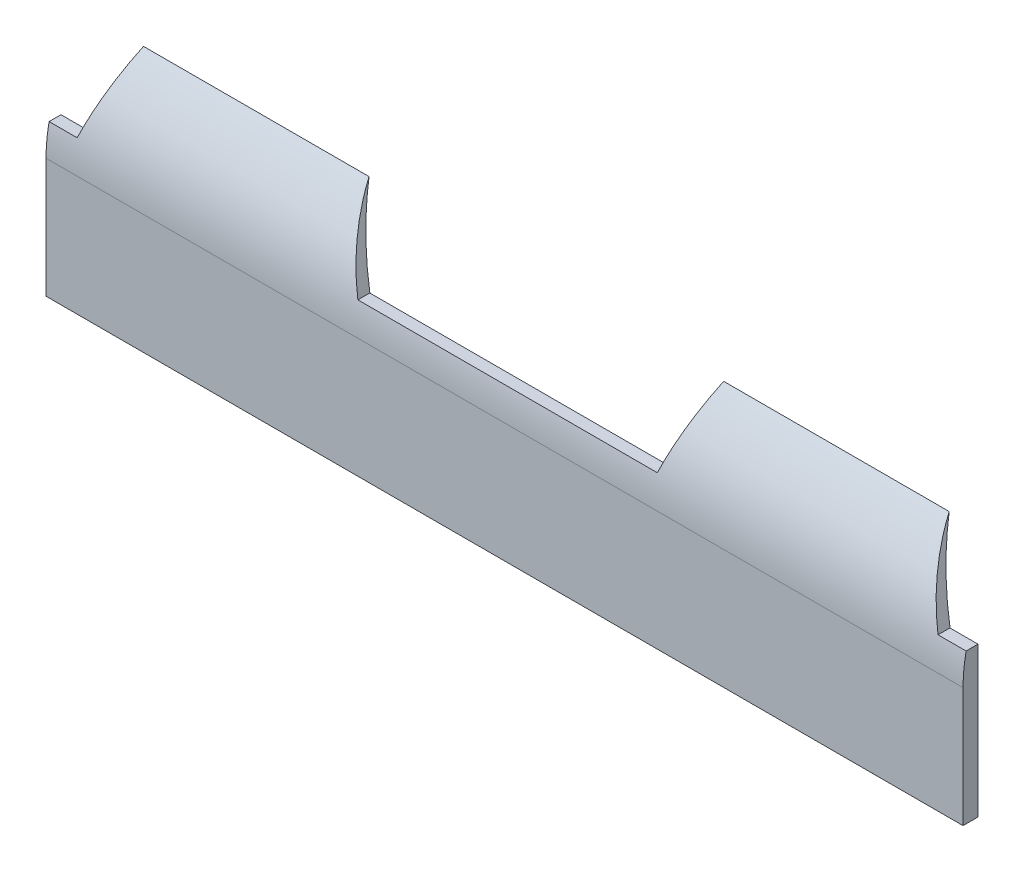
ISO-10303-21;
HEADER;
FILE_DESCRIPTION(('STEP AP214'),'2;1');
FILE_NAME('part.step','',(''),(''),'','','');
FILE_SCHEMA(('AUTOMOTIVE_DESIGN { 1 0 10303 214 1 1 1 1 }'));
ENDSEC;
DATA;
#1=APPLICATION_CONTEXT('core data for automotive mechanical design processes');
#2=APPLICATION_PROTOCOL_DEFINITION('international standard','automotive_design',2000,#1);
#3=PRODUCT_CONTEXT('',#1,'mechanical');
#4=PRODUCT('Part','Part','',(#3));
#5=PRODUCT_RELATED_PRODUCT_CATEGORY('part','',(#4));
#6=PRODUCT_DEFINITION_FORMATION('','',#4);
#7=PRODUCT_DEFINITION_CONTEXT('part definition',#1,'design');
#8=PRODUCT_DEFINITION('design','',#6,#7);
#9=PRODUCT_DEFINITION_SHAPE('','',#8);
#10=(LENGTH_UNIT() NAMED_UNIT(*) SI_UNIT(.MILLI.,.METRE.));
#11=(NAMED_UNIT(*) PLANE_ANGLE_UNIT() SI_UNIT($,.RADIAN.));
#12=(NAMED_UNIT(*) SI_UNIT($,.STERADIAN.) SOLID_ANGLE_UNIT());
#13=UNCERTAINTY_MEASURE_WITH_UNIT(LENGTH_MEASURE(1.E-05),#10,'distance_accuracy_value','');
#14=(GEOMETRIC_REPRESENTATION_CONTEXT(3) GLOBAL_UNCERTAINTY_ASSIGNED_CONTEXT((#13)) GLOBAL_UNIT_ASSIGNED_CONTEXT((#10,
#11,#12)) REPRESENTATION_CONTEXT('',''));
#15=CARTESIAN_POINT('',(0.,0.,0.));
#16=DIRECTION('',(0.,0.,1.));
#17=DIRECTION('',(1.,0.,0.));
#18=AXIS2_PLACEMENT_3D('',#15,#16,#17);
#19=CARTESIAN_POINT('',(0.,0.,0.));
#20=DIRECTION('',(0.,0.,1.));
#21=DIRECTION('',(1.,0.,0.));
#22=AXIS2_PLACEMENT_3D('',#19,#20,#21);
#23=PLANE('',#22);
#24=DIRECTION('',(1.,0.,0.));
#25=VECTOR('',#24,1.);
#26=CARTESIAN_POINT('',(24.5,-0.229513462657604,0.));
#27=LINE('',#26,#25);
#28=CARTESIAN_POINT('',(-24.5,-0.229513462657604,0.));
#29=VERTEX_POINT('',#28);
#30=CARTESIAN_POINT('',(24.5,-0.229513462657604,0.));
#31=VERTEX_POINT('',#30);
#32=EDGE_CURVE('E171',#29,#31,#27,.T.);
#33=ORIENTED_EDGE('',*,*,#32,.F.);
#34=DIRECTION('',(0.,-1.,0.));
#35=VECTOR('',#34,1.);
#36=CARTESIAN_POINT('',(-24.5,-0.229513462657604,0.));
#37=LINE('',#36,#35);
#38=CARTESIAN_POINT('',(-24.5,7.7704865373424,0.));
#39=VERTEX_POINT('',#38);
#40=EDGE_CURVE('E217',#39,#29,#37,.T.);
#41=ORIENTED_EDGE('',*,*,#40,.F.);
#42=DIRECTION('',(-1.,0.,0.));
#43=VECTOR('',#42,1.);
#44=CARTESIAN_POINT('',(-24.5,7.7704865373424,0.));
#45=LINE('',#44,#43);
#46=CARTESIAN_POINT('',(-23.,7.7704865373424,0.));
#47=VERTEX_POINT('',#46);
#48=EDGE_CURVE('E219',#47,#39,#45,.T.);
#49=ORIENTED_EDGE('',*,*,#48,.F.);
#50=DIRECTION('',(-0.999999999999999,-4.84887273273041E-08,0.));
#51=VECTOR('',#50,1.);
#52=CARTESIAN_POINT('',(-7.99999999999999,7.77048726467331,0.));
#53=LINE('',#52,#51);
#54=CARTESIAN_POINT('',(-7.99999999999999,7.77048726467331,0.));
#55=VERTEX_POINT('',#54);
#56=EDGE_CURVE('E240',#55,#47,#53,.T.);
#57=ORIENTED_EDGE('',*,*,#56,.F.);
#58=DIRECTION('',(-1.,0.,0.));
#59=VECTOR('',#58,1.);
#60=CARTESIAN_POINT('',(-7.99999999999999,7.77048726467331,0.));
#61=LINE('',#60,#59);
#62=CARTESIAN_POINT('',(8.,7.77048726467331,0.));
#63=VERTEX_POINT('',#62);
#64=EDGE_CURVE('E222',#63,#55,#61,.T.);
#65=ORIENTED_EDGE('',*,*,#64,.F.);
#66=DIRECTION('',(-0.999999999999999,4.84887274429523E-08,0.));
#67=VECTOR('',#66,1.);
#68=CARTESIAN_POINT('',(8.,7.77048726467331,0.));
#69=LINE('',#68,#67);
#70=CARTESIAN_POINT('',(23.,7.7704865373424,0.));
#71=VERTEX_POINT('',#70);
#72=EDGE_CURVE('E233',#71,#63,#69,.T.);
#73=ORIENTED_EDGE('',*,*,#72,.F.);
#74=DIRECTION('',(-1.,0.,0.));
#75=VECTOR('',#74,1.);
#76=CARTESIAN_POINT('',(24.5,7.7704865373424,0.));
#77=LINE('',#76,#75);
#78=CARTESIAN_POINT('',(24.5,7.7704865373424,0.));
#79=VERTEX_POINT('',#78);
#80=EDGE_CURVE('E224',#79,#71,#77,.T.);
#81=ORIENTED_EDGE('',*,*,#80,.F.);
#82=DIRECTION('',(0.,1.,0.));
#83=VECTOR('',#82,1.);
#84=CARTESIAN_POINT('',(24.5,-0.229513462657604,0.));
#85=LINE('',#84,#83);
#86=EDGE_CURVE('E227',#31,#79,#85,.T.);
#87=ORIENTED_EDGE('',*,*,#86,.F.);
#88=EDGE_LOOP('',(#33,#41,#49,#57,#65,#73,#81,#87));
#89=FACE_BOUND('',#88,.T.);
#90=ADVANCED_FACE('F34',(#89),#23,.F.);
#91=CARTESIAN_POINT('',(24.5,-0.229513462657604,0.8));
#92=DIRECTION('',(-1.,0.,0.));
#93=DIRECTION('',(0.,0.,1.));
#94=AXIS2_PLACEMENT_3D('',#91,#92,#93);
#95=PLANE('',#94);
#96=DIRECTION('',(0.,0.,-1.));
#97=VECTOR('',#96,1.);
#98=CARTESIAN_POINT('',(24.5,7.7704865373424,0.8));
#99=LINE('',#98,#97);
#100=CARTESIAN_POINT('',(24.5,7.7704865373424,0.635624738474644));
#101=VERTEX_POINT('',#100);
#102=EDGE_CURVE('E160',#101,#79,#99,.T.);
#103=ORIENTED_EDGE('',*,*,#102,.F.);
#104=CARTESIAN_POINT('',(24.5,6.15710965706793,-7.2));
#105=DIRECTION('',(-1.,0.,0.));
#106=DIRECTION('',(0.,0.,1.));
#107=AXIS2_PLACEMENT_3D('',#104,#105,#106);
#108=CIRCLE('',#107,8.);
#109=CARTESIAN_POINT('',(24.5,6.15710965706793,0.8));
#110=VERTEX_POINT('',#109);
#111=EDGE_CURVE('E133',#101,#110,#108,.F.);
#112=ORIENTED_EDGE('',*,*,#111,.T.);
#113=DIRECTION('',(0.,1.,0.));
#114=VECTOR('',#113,1.);
#115=CARTESIAN_POINT('',(24.5,-0.229513462657604,0.8));
#116=LINE('',#115,#114);
#117=CARTESIAN_POINT('',(24.5,-0.229513462657604,0.8));
#118=VERTEX_POINT('',#117);
#119=EDGE_CURVE('E158',#118,#110,#116,.T.);
#120=ORIENTED_EDGE('',*,*,#119,.F.);
#121=DIRECTION('',(0.,0.,-1.));
#122=VECTOR('',#121,1.);
#123=CARTESIAN_POINT('',(24.5,-0.229513462657604,0.8));
#124=LINE('',#123,#122);
#125=EDGE_CURVE('E214',#118,#31,#124,.T.);
#126=ORIENTED_EDGE('',*,*,#125,.T.);
#127=ORIENTED_EDGE('',*,*,#86,.T.);
#128=EDGE_LOOP('',(#103,#112,#120,#126,#127));
#129=FACE_BOUND('',#128,.T.);
#130=ADVANCED_FACE('F156',(#129),#95,.F.);
#131=CARTESIAN_POINT('',(24.5,7.7704865373424,0.8));
#132=DIRECTION('',(0.,-1.,0.));
#133=DIRECTION('',(0.,0.,-1.));
#134=AXIS2_PLACEMENT_3D('',#131,#132,#133);
#135=PLANE('',#134);
#136=DIRECTION('',(0.,0.,-1.));
#137=VECTOR('',#136,1.);
#138=CARTESIAN_POINT('',(23.,7.7704865373424,0.8));
#139=LINE('',#138,#137);
#140=CARTESIAN_POINT('',(23.,7.7704865373424,0.635624738474644));
#141=VERTEX_POINT('',#140);
#142=EDGE_CURVE('E178',#141,#71,#139,.T.);
#143=ORIENTED_EDGE('',*,*,#142,.F.);
#144=DIRECTION('',(1.,0.,0.));
#145=VECTOR('',#144,1.);
#146=CARTESIAN_POINT('',(23.,7.7704865373424,0.635624738474644));
#147=LINE('',#146,#145);
#148=EDGE_CURVE('E145',#141,#101,#147,.T.);
#149=ORIENTED_EDGE('',*,*,#148,.T.);
#150=ORIENTED_EDGE('',*,*,#102,.T.);
#151=ORIENTED_EDGE('',*,*,#80,.T.);
#152=EDGE_LOOP('',(#143,#149,#150,#151));
#153=FACE_BOUND('',#152,.T.);
#154=ADVANCED_FACE('F288',(#153),#135,.F.);
#155=CARTESIAN_POINT('',(23.,7.7704865373424,0.8));
#156=DIRECTION('',(-0.936329167073855,-0.351123469575561,0.));
#157=DIRECTION('',(0.351123469575561,-0.936329167073856,0.));
#158=AXIS2_PLACEMENT_3D('',#155,#156,#157);
#159=PLANE('',#158);
#160=DIRECTION('',(0.,0.,1.));
#161=VECTOR('',#160,1.);
#162=CARTESIAN_POINT('',(23.,7.7704865373424,-1.5));
#163=LINE('',#162,#161);
#164=CARTESIAN_POINT('',(23.,7.7704865373424,-0.0055257935757476));
#165=VERTEX_POINT('',#164);
#166=EDGE_CURVE('E140',#165,#71,#163,.T.);
#167=ORIENTED_EDGE('',*,*,#166,.F.);
#168=CARTESIAN_POINT('',(23.,7.7704865373424,-0.0055257935757476));
#169=CARTESIAN_POINT('',(22.9348155949192,7.94431160175446,-0.0371606757691253));
#170=CARTESIAN_POINT('',(22.8698461018174,8.11756356760763,-0.0722636296588323));
#171=CARTESIAN_POINT('',(22.7404257567151,8.46268445650327,-0.149604056933453));
#172=CARTESIAN_POINT('',(22.6759749636338,8.63455322242773,-0.191842329164443));
#173=CARTESIAN_POINT('',(22.484479351803,9.14520814088309,-0.328885013453234));
#174=CARTESIAN_POINT('',(22.3583498409335,9.48155347262247,-0.434468042109243));
#175=CARTESIAN_POINT('',(22.1700886455069,9.98358328145065,-0.616660946270606));
#176=CARTESIAN_POINT('',(22.1066342896654,10.1527948816439,-0.68242732993202));
#177=CARTESIAN_POINT('',(21.9807859033027,10.4883905480999,-0.821779546619528));
#178=CARTESIAN_POINT('',(21.9183918828236,10.6547745875838,-0.895365453653518));
#179=CARTESIAN_POINT('',(21.7943622692044,10.9855201938316,-1.0508676933805));
#180=CARTESIAN_POINT('',(21.7327353472863,11.1498586373387,-1.1328400852278));
#181=CARTESIAN_POINT('',(21.6108262476991,11.4749495400151,-1.30454891831277));
#182=CARTESIAN_POINT('',(21.5505441344939,11.6357018272806,-1.39428573073931));
#183=CARTESIAN_POINT('',(21.4909998628072,11.7944865373424,-1.48783991768753));
#184=B_SPLINE_CURVE_WITH_KNOTS('',3,(#168,#169,#170,#171,#172,#173,#174,#175,#176,#177,#178,
#179,#180,#181,#182,#183),.UNSPECIFIED.,.F.,.F.,(4,2,2,2,2,2,2,4),(0.,0.56488410660878,
1.12983149769325,2.25159107969456,2.82838642041428,3.4051872207012,3.98613264097389,
4.56710584950628),.UNSPECIFIED.);
#185=CARTESIAN_POINT('',(21.5251386268273,11.7034498415655,-1.43474974022572));
#186=VERTEX_POINT('',#185);
#187=EDGE_CURVE('E127',#165,#186,#184,.T.);
#188=ORIENTED_EDGE('',*,*,#187,.T.);
#189=CARTESIAN_POINT('',(23.6050163851088,6.15710965706793,-7.2));
#190=DIRECTION('',(-0.936329167073855,-0.351123469575561,0.));
#191=DIRECTION('',(0.351123469575561,-0.936329167073856,0.));
#192=AXIS2_PLACEMENT_3D('',#189,#190,#191);
#193=ELLIPSE('',#192,8.54400384108613,8.);
#194=EDGE_CURVE('E138',#186,#141,#193,.F.);
#195=ORIENTED_EDGE('',*,*,#194,.T.);
#196=ORIENTED_EDGE('',*,*,#142,.T.);
#197=EDGE_LOOP('',(#167,#188,#195,#196));
#198=FACE_BOUND('',#197,.T.);
#199=ADVANCED_FACE('F136',(#198),#159,.F.);
#200=CARTESIAN_POINT('',(9.49999986362547,11.7704865373424,0.8));
#201=DIRECTION('',(0.936329167073852,-0.351123469575569,0.));
#202=DIRECTION('',(0.351123469575569,0.936329167073852,0.));
#203=AXIS2_PLACEMENT_3D('',#200,#201,#202);
#204=PLANE('',#203);
#205=CARTESIAN_POINT('',(7.39498334214206,6.15710965706792,-7.2));
#206=DIRECTION('',(0.936329167073852,-0.351123469575569,0.));
#207=DIRECTION('',(0.351123469575569,0.936329167073852,0.));
#208=AXIS2_PLACEMENT_3D('',#205,#206,#207);
#209=ELLIPSE('',#208,8.54400384108616,8.);
#210=CARTESIAN_POINT('',(8.,7.77048726467331,0.635624588715154));
#211=VERTEX_POINT('',#210);
#212=CARTESIAN_POINT('',(9.47486110042361,11.7034498415655,-1.43474974022572));
#213=VERTEX_POINT('',#212);
#214=EDGE_CURVE('E146',#211,#213,#209,.F.);
#215=ORIENTED_EDGE('',*,*,#214,.T.);
#216=CARTESIAN_POINT('',(9.50899986280723,11.7944865329784,-1.48783991511669));
#217=CARTESIAN_POINT('',(9.45113309148524,11.6401751568159,-1.39692252302169));
#218=CARTESIAN_POINT('',(9.39256968651653,11.4840060910977,-1.30960924733738));
#219=CARTESIAN_POINT('',(9.27416953471842,11.1682723816747,-1.14231283134295));
#220=CARTESIAN_POINT('',(9.21433285199569,11.0087079089211,-1.06232932306647));
#221=CARTESIAN_POINT('',(9.09391998097712,10.6876069487316,-0.910335024739279));
#222=CARTESIAN_POINT('',(9.03335181871509,10.5260918640506,-0.838272704257383));
#223=CARTESIAN_POINT('',(8.91120272100535,10.2003609664389,-0.701533850152282));
#224=CARTESIAN_POINT('',(8.84962178605162,10.0361451548255,-0.636857312926855));
#225=CARTESIAN_POINT('',(8.65988877685487,9.53019050963377,-0.450322803052724));
#226=CARTESIAN_POINT('',(8.53025666015879,9.1845048965393,-0.340389386495372));
#227=CARTESIAN_POINT('',(8.33335257776711,8.65942739123305,-0.198092807003036));
#228=CARTESIAN_POINT('',(8.26705852957954,8.4826432788055,-0.154308250870661));
#229=CARTESIAN_POINT('',(8.13391890180389,8.12760430368247,-0.0743011645936076));
#230=CARTESIAN_POINT('',(8.06707339760022,7.94934964201207,-0.0380776180933938));
#231=CARTESIAN_POINT('',(8.00000000000023,7.77048726467313,-0.00552592594566467));
#232=B_SPLINE_CURVE_WITH_KNOTS('',3,(#216,#217,#218,#219,#220,#221,#222,#223,#224,#225,#226,
#227,#228,#229,#230,#231),.UNSPECIFIED.,.F.,.F.,(4,2,2,2,2,2,2,4),(0.,0.564606994083395,
1.12918562842458,1.68984180368021,2.25049770548937,3.4045099505005,3.98583646943266,
4.56708479570457),.UNSPECIFIED.);
#233=CARTESIAN_POINT('',(8.,7.77048726467331,-0.00552592594568842));
#234=VERTEX_POINT('',#233);
#235=EDGE_CURVE('E56',#213,#234,#232,.T.);
#236=ORIENTED_EDGE('',*,*,#235,.T.);
#237=DIRECTION('',(0.,0.,1.));
#238=VECTOR('',#237,1.);
#239=CARTESIAN_POINT('',(8.,7.77048726467331,-1.5));
#240=LINE('',#239,#238);
#241=EDGE_CURVE('E202',#234,#63,#240,.T.);
#242=ORIENTED_EDGE('',*,*,#241,.T.);
#243=DIRECTION('',(0.,0.,-1.));
#244=VECTOR('',#243,1.);
#245=CARTESIAN_POINT('',(8.,7.77048726467331,0.8));
#246=LINE('',#245,#244);
#247=EDGE_CURVE('E194',#211,#63,#246,.T.);
#248=ORIENTED_EDGE('',*,*,#247,.F.);
#249=EDGE_LOOP('',(#215,#236,#242,#248));
#250=FACE_BOUND('',#249,.T.);
#251=ADVANCED_FACE('F200',(#250),#204,.F.);
#252=CARTESIAN_POINT('',(-7.99999999999999,7.77048726467331,0.8));
#253=DIRECTION('',(0.,-1.,0.));
#254=DIRECTION('',(1.,0.,0.));
#255=AXIS2_PLACEMENT_3D('',#252,#253,#254);
#256=PLANE('',#255);
#257=DIRECTION('',(0.,0.,-1.));
#258=VECTOR('',#257,1.);
#259=CARTESIAN_POINT('',(-7.99999999999999,7.77048726467331,0.8));
#260=LINE('',#259,#258);
#261=CARTESIAN_POINT('',(-7.99999999999999,7.77048726467331,0.635624588715153));
#262=VERTEX_POINT('',#261);
#263=EDGE_CURVE('E197',#262,#55,#260,.T.);
#264=ORIENTED_EDGE('',*,*,#263,.F.);
#265=DIRECTION('',(1.,0.,0.));
#266=VECTOR('',#265,1.);
#267=CARTESIAN_POINT('',(-7.99999999999999,7.77048726467331,0.635624588715153));
#268=LINE('',#267,#266);
#269=EDGE_CURVE('E149',#262,#211,#268,.T.);
#270=ORIENTED_EDGE('',*,*,#269,.T.);
#271=ORIENTED_EDGE('',*,*,#247,.T.);
#272=ORIENTED_EDGE('',*,*,#64,.T.);
#273=EDGE_LOOP('',(#264,#270,#271,#272));
#274=FACE_BOUND('',#273,.T.);
#275=ADVANCED_FACE('F192',(#274),#256,.F.);
#276=CARTESIAN_POINT('',(-9.49999986362546,11.7704865373424,0.8));
#277=DIRECTION('',(-0.936329167073852,-0.351123469575569,0.));
#278=DIRECTION('',(0.351123469575569,-0.936329167073852,0.));
#279=AXIS2_PLACEMENT_3D('',#276,#277,#278);
#280=PLANE('',#279);
#281=DIRECTION('',(0.,0.,1.));
#282=VECTOR('',#281,1.);
#283=CARTESIAN_POINT('',(-7.99999999999999,7.77048726467331,-1.5));
#284=LINE('',#283,#282);
#285=CARTESIAN_POINT('',(-7.99999999999999,7.77048726467331,-0.00552592594568809));
#286=VERTEX_POINT('',#285);
#287=EDGE_CURVE('E236',#286,#55,#284,.T.);
#288=ORIENTED_EDGE('',*,*,#287,.F.);
#289=CARTESIAN_POINT('',(-7.99999999999999,7.77048726467331,-0.00552592594568809));
#290=CARTESIAN_POINT('',(-8.0651843933978,7.94431229793059,-0.0371608124274125));
#291=CARTESIAN_POINT('',(-8.13015387481558,8.11756423262656,-0.0722637695709482));
#292=CARTESIAN_POINT('',(-8.25957419658363,8.46268505929754,-0.149604201140874));
#293=CARTESIAN_POINT('',(-8.32402497801468,8.63455379415465,-0.19184247441261));
#294=CARTESIAN_POINT('',(-8.51552055546975,9.1452086209413,-0.328885158502201));
#295=CARTESIAN_POINT('',(-8.64165004372686,9.48155389238096,-0.434468182522148));
#296=CARTESIAN_POINT('',(-8.82991120500787,9.98358361015426,-0.616661071703184));
#297=CARTESIAN_POINT('',(-8.89336554901075,10.1527951787778,-0.682427448560902));
#298=CARTESIAN_POINT('',(-9.01921391199854,10.4883907829008,-0.821779648867328));
#299=CARTESIAN_POINT('',(-9.08160792094142,10.6547747916214,-0.89536554632388));
#300=CARTESIAN_POINT('',(-9.20563751164412,10.9855203367585,-1.05086776385997));
#301=CARTESIAN_POINT('',(-9.26726442218736,11.1498587499327,-1.13284014305581));
#302=CARTESIAN_POINT('',(-9.3891734994829,11.4749495931647,-1.30454894803201));
#303=CARTESIAN_POINT('',(-9.44945560177136,11.6357018513189,-1.39428574500079));
#304=CARTESIAN_POINT('',(-9.5089998628072,11.7944865329784,-1.48783991511669));
#305=B_SPLINE_CURVE_WITH_KNOTS('',3,(#289,#290,#291,#292,#293,#294,#295,#296,#297,#298,#299,
#300,#301,#302,#303,#304),.UNSPECIFIED.,.F.,.F.,(4,2,2,2,2,2,2,4),(0.,0.564884010400301,
1.12983130522721,2.25159069862626,2.8283859373903,3.40518663571862,3.98613195197701,
4.56710505646791),.UNSPECIFIED.);
#306=CARTESIAN_POINT('',(-9.4748611004236,11.7034498415655,-1.43474974022572));
#307=VERTEX_POINT('',#306);
#308=EDGE_CURVE('E251',#286,#307,#305,.T.);
#309=ORIENTED_EDGE('',*,*,#308,.T.);
#310=CARTESIAN_POINT('',(-7.39498334214205,6.15710965706792,-7.2));
#311=DIRECTION('',(-0.936329167073852,-0.351123469575569,0.));
#312=DIRECTION('',(0.351123469575569,-0.936329167073852,0.));
#313=AXIS2_PLACEMENT_3D('',#310,#311,#312);
#314=ELLIPSE('',#313,8.54400384108616,8.);
#315=EDGE_CURVE('E186',#307,#262,#314,.F.);
#316=ORIENTED_EDGE('',*,*,#315,.T.);
#317=ORIENTED_EDGE('',*,*,#263,.T.);
#318=EDGE_LOOP('',(#288,#309,#316,#317));
#319=FACE_BOUND('',#318,.T.);
#320=ADVANCED_FACE('F317',(#319),#280,.F.);
#321=CARTESIAN_POINT('',(-23.,7.7704865373424,0.8));
#322=DIRECTION('',(0.936329167073855,-0.351123469575562,0.));
#323=DIRECTION('',(0.351123469575562,0.936329167073855,0.));
#324=AXIS2_PLACEMENT_3D('',#321,#322,#323);
#325=PLANE('',#324);
#326=CARTESIAN_POINT('',(-23.6050163851088,6.15710965706791,-7.2));
#327=DIRECTION('',(0.936329167073855,-0.351123469575562,0.));
#328=DIRECTION('',(0.351123469575562,0.936329167073855,0.));
#329=AXIS2_PLACEMENT_3D('',#326,#327,#328);
#330=ELLIPSE('',#329,8.54400384108613,8.);
#331=CARTESIAN_POINT('',(-23.,7.7704865373424,0.635624738474642));
#332=VERTEX_POINT('',#331);
#333=CARTESIAN_POINT('',(-21.5251386268273,11.7034498415655,-1.43474974022572));
#334=VERTEX_POINT('',#333);
#335=EDGE_CURVE('E183',#332,#334,#330,.F.);
#336=ORIENTED_EDGE('',*,*,#335,.T.);
#337=CARTESIAN_POINT('',(-21.4909998628072,11.7944865373424,-1.48783991768753));
#338=CARTESIAN_POINT('',(-21.5488666439534,11.640175134982,-1.39692251006296));
#339=CARTESIAN_POINT('',(-21.6074300589845,11.4840060424307,-1.30960922008044));
#340=CARTESIAN_POINT('',(-21.7258302313199,11.1682722782415,-1.14231277800421));
#341=CARTESIAN_POINT('',(-21.7856669245175,11.0087077775551,-1.06232925794376));
#342=CARTESIAN_POINT('',(-21.9060798166356,10.6876067611001,-0.910334938843821));
#343=CARTESIAN_POINT('',(-21.9666479895175,10.5260916480996,-0.838272609339563));
#344=CARTESIAN_POINT('',(-22.0887971087436,10.2003606931108,-0.701533739678443));
#345=CARTESIAN_POINT('',(-22.150378054594,10.0361448524397,-0.636857195919365));
#346=CARTESIAN_POINT('',(-22.3401110986482,9.53019011429464,-0.450322668647327));
#347=CARTESIAN_POINT('',(-22.4697432397064,9.18450443623449,-0.340389245485607));
#348=CARTESIAN_POINT('',(-22.6666473591851,8.65942683202972,-0.198092663670631));
#349=CARTESIAN_POINT('',(-22.7329414199532,8.482642686054,-0.154308108005942));
#350=CARTESIAN_POINT('',(-22.8660810729372,8.12760364370866,-0.0743010251522821));
#351=CARTESIAN_POINT('',(-22.9329265897686,7.94934894836424,-0.0380774816067972));
#352=CARTESIAN_POINT('',(-22.9999999999998,7.77048653734222,-0.00552579357572432));
#353=B_SPLINE_CURVE_WITH_KNOTS('',3,(#337,#338,#339,#340,#341,#342,#343,#344,#345,#346,#347,
#348,#349,#350,#351,#352),.UNSPECIFIED.,.F.,.F.,(4,2,2,2,2,2,2,4),(0.,0.564607090056557,
1.12918582034575,1.68984208966994,2.25049808554816,3.40451053490988,3.98583715818043,
4.56708558872705),.UNSPECIFIED.);
#354=CARTESIAN_POINT('',(-23.,7.7704865373424,-0.0055257935757476));
#355=VERTEX_POINT('',#354);
#356=EDGE_CURVE('E48',#334,#355,#353,.T.);
#357=ORIENTED_EDGE('',*,*,#356,.T.);
#358=DIRECTION('',(0.,0.,1.));
#359=VECTOR('',#358,1.);
#360=CARTESIAN_POINT('',(-23.,7.7704865373424,-1.5));
#361=LINE('',#360,#359);
#362=EDGE_CURVE('E238',#355,#47,#361,.T.);
#363=ORIENTED_EDGE('',*,*,#362,.T.);
#364=DIRECTION('',(0.,0.,-1.));
#365=VECTOR('',#364,1.);
#366=CARTESIAN_POINT('',(-23.,7.7704865373424,0.8));
#367=LINE('',#366,#365);
#368=EDGE_CURVE('E204',#332,#47,#367,.T.);
#369=ORIENTED_EDGE('',*,*,#368,.F.);
#370=EDGE_LOOP('',(#336,#357,#363,#369));
#371=FACE_BOUND('',#370,.T.);
#372=ADVANCED_FACE('F313',(#371),#325,.F.);
#373=CARTESIAN_POINT('',(-24.5,7.7704865373424,0.8));
#374=DIRECTION('',(0.,-1.,0.));
#375=DIRECTION('',(0.,0.,-1.));
#376=AXIS2_PLACEMENT_3D('',#373,#374,#375);
#377=PLANE('',#376);
#378=DIRECTION('',(0.,0.,-1.));
#379=VECTOR('',#378,1.);
#380=CARTESIAN_POINT('',(-24.5,7.7704865373424,0.8));
#381=LINE('',#380,#379);
#382=CARTESIAN_POINT('',(-24.5,7.7704865373424,0.63562473847464));
#383=VERTEX_POINT('',#382);
#384=EDGE_CURVE('E209',#383,#39,#381,.T.);
#385=ORIENTED_EDGE('',*,*,#384,.F.);
#386=DIRECTION('',(1.,0.,0.));
#387=VECTOR('',#386,1.);
#388=CARTESIAN_POINT('',(-24.5,7.7704865373424,0.63562473847464));
#389=LINE('',#388,#387);
#390=EDGE_CURVE('E176',#383,#332,#389,.T.);
#391=ORIENTED_EDGE('',*,*,#390,.T.);
#392=ORIENTED_EDGE('',*,*,#368,.T.);
#393=ORIENTED_EDGE('',*,*,#48,.T.);
#394=EDGE_LOOP('',(#385,#391,#392,#393));
#395=FACE_BOUND('',#394,.T.);
#396=ADVANCED_FACE('F309',(#395),#377,.F.);
#397=CARTESIAN_POINT('',(-24.5,-0.229513462657604,0.8));
#398=DIRECTION('',(1.,0.,0.));
#399=DIRECTION('',(0.,0.,-1.));
#400=AXIS2_PLACEMENT_3D('',#397,#398,#399);
#401=PLANE('',#400);
#402=DIRECTION('',(0.,-1.,0.));
#403=VECTOR('',#402,1.);
#404=CARTESIAN_POINT('',(-24.5,-0.229513462657604,0.8));
#405=LINE('',#404,#403);
#406=CARTESIAN_POINT('',(-24.5,6.15710965706791,0.8));
#407=VERTEX_POINT('',#406);
#408=CARTESIAN_POINT('',(-24.5,-0.229513462657604,0.8));
#409=VERTEX_POINT('',#408);
#410=EDGE_CURVE('E170',#407,#409,#405,.T.);
#411=ORIENTED_EDGE('',*,*,#410,.F.);
#412=CARTESIAN_POINT('',(-24.5,6.15710965706791,-7.2));
#413=DIRECTION('',(1.,0.,0.));
#414=DIRECTION('',(0.,0.,-1.));
#415=AXIS2_PLACEMENT_3D('',#412,#413,#414);
#416=CIRCLE('',#415,8.);
#417=EDGE_CURVE('E174',#407,#383,#416,.F.);
#418=ORIENTED_EDGE('',*,*,#417,.T.);
#419=ORIENTED_EDGE('',*,*,#384,.T.);
#420=ORIENTED_EDGE('',*,*,#40,.T.);
#421=DIRECTION('',(0.,0.,-1.));
#422=VECTOR('',#421,1.);
#423=CARTESIAN_POINT('',(-24.5,-0.229513462657604,0.8));
#424=LINE('',#423,#422);
#425=EDGE_CURVE('E211',#409,#29,#424,.T.);
#426=ORIENTED_EDGE('',*,*,#425,.F.);
#427=EDGE_LOOP('',(#411,#418,#419,#420,#426));
#428=FACE_BOUND('',#427,.T.);
#429=ADVANCED_FACE('F305',(#428),#401,.F.);
#430=CARTESIAN_POINT('',(24.5,-0.229513462657604,0.8));
#431=DIRECTION('',(0.,1.,0.));
#432=DIRECTION('',(0.,0.,1.));
#433=AXIS2_PLACEMENT_3D('',#430,#431,#432);
#434=PLANE('',#433);
#435=ORIENTED_EDGE('',*,*,#32,.T.);
#436=ORIENTED_EDGE('',*,*,#125,.F.);
#437=DIRECTION('',(1.,0.,0.));
#438=VECTOR('',#437,1.);
#439=CARTESIAN_POINT('',(24.5,-0.229513462657604,0.8));
#440=LINE('',#439,#438);
#441=EDGE_CURVE('E168',#409,#118,#440,.T.);
#442=ORIENTED_EDGE('',*,*,#441,.F.);
#443=ORIENTED_EDGE('',*,*,#425,.T.);
#444=EDGE_LOOP('',(#435,#436,#442,#443));
#445=FACE_BOUND('',#444,.T.);
#446=ADVANCED_FACE('F302',(#445),#434,.F.);
#447=CARTESIAN_POINT('',(0.,0.,0.8));
#448=DIRECTION('',(0.,0.,1.));
#449=DIRECTION('',(1.,0.,0.));
#450=AXIS2_PLACEMENT_3D('',#447,#448,#449);
#451=PLANE('',#450);
#452=ORIENTED_EDGE('',*,*,#119,.T.);
#453=DIRECTION('',(-1.,0.,0.));
#454=VECTOR('',#453,1.);
#455=CARTESIAN_POINT('',(9.49999986362547,6.15710965706792,0.8));
#456=LINE('',#455,#454);
#457=EDGE_CURVE('E165',#110,#407,#456,.T.);
#458=ORIENTED_EDGE('',*,*,#457,.T.);
#459=ORIENTED_EDGE('',*,*,#410,.T.);
#460=ORIENTED_EDGE('',*,*,#441,.T.);
#461=EDGE_LOOP('',(#452,#458,#459,#460));
#462=FACE_BOUND('',#461,.T.);
#463=ADVANCED_FACE('F164',(#462),#451,.T.);
#464=CARTESIAN_POINT('',(8.,7.77048726467331,-1.5));
#465=DIRECTION('',(4.84887274429523E-08,0.999999999999999,0.));
#466=DIRECTION('',(-0.999999999999999,4.84887274429523E-08,0.));
#467=AXIS2_PLACEMENT_3D('',#464,#465,#466);
#468=PLANE('',#467);
#469=ORIENTED_EDGE('',*,*,#241,.F.);
#470=CARTESIAN_POINT('',(8.,7.77048726467331,-0.00552592594568874));
#471=CARTESIAN_POINT('',(11.5698267288865,7.77048709157695,-0.00552589444316661));
#472=CARTESIAN_POINT('',(15.1396534577729,7.7704869184806,-0.00552586294064826));
#473=CARTESIAN_POINT('',(20.1396534577729,7.77048667603696,-0.00552581881733788));
#474=CARTESIAN_POINT('',(21.5698267288865,7.77048660668968,-0.00552580619654266));
#475=CARTESIAN_POINT('',(23.,7.7704865373424,-0.00552579357574804));
#476=B_SPLINE_CURVE_WITH_KNOTS('',3,(#470,#471,#472,#473,#474,#475),.UNSPECIFIED.,.F.,.F.,(4,2,
4),(0.,10.7094801866594,15.),.UNSPECIFIED.);
#477=EDGE_CURVE('E141',#234,#165,#476,.T.);
#478=ORIENTED_EDGE('',*,*,#477,.T.);
#479=ORIENTED_EDGE('',*,*,#166,.T.);
#480=ORIENTED_EDGE('',*,*,#72,.T.);
#481=EDGE_LOOP('',(#469,#478,#479,#480));
#482=FACE_BOUND('',#481,.T.);
#483=ADVANCED_FACE('F326',(#482),#468,.F.);
#484=CARTESIAN_POINT('',(-7.99999999999999,7.77048726467331,-1.5));
#485=DIRECTION('',(-4.84887273273041E-08,0.999999999999999,0.));
#486=DIRECTION('',(-0.999999999999999,-4.84887273273041E-08,0.));
#487=AXIS2_PLACEMENT_3D('',#484,#485,#486);
#488=PLANE('',#487);
#489=ORIENTED_EDGE('',*,*,#362,.F.);
#490=CARTESIAN_POINT('',(-23.,7.7704865373424,-0.00552579357574798));
#491=CARTESIAN_POINT('',(-19.4301732711136,7.77048671043875,-0.00552582507825974));
#492=CARTESIAN_POINT('',(-15.8603465422271,7.7704868835351,-0.00552585658077503));
#493=CARTESIAN_POINT('',(-10.8603465422271,7.77048712597874,-0.0055259007040914));
#494=CARTESIAN_POINT('',(-9.43017327111355,7.77048719532602,-0.00552591332488951));
#495=CARTESIAN_POINT('',(-7.99999999999999,7.7704872646733,-0.00552592594568818));
#496=B_SPLINE_CURVE_WITH_KNOTS('',3,(#490,#491,#492,#493,#494,#495),.UNSPECIFIED.,.F.,.F.,(4,2,
4),(0.,10.7094801866594,15.),.UNSPECIFIED.);
#497=EDGE_CURVE('E243',#355,#286,#496,.T.);
#498=ORIENTED_EDGE('',*,*,#497,.T.);
#499=ORIENTED_EDGE('',*,*,#287,.T.);
#500=ORIENTED_EDGE('',*,*,#56,.T.);
#501=EDGE_LOOP('',(#489,#498,#499,#500));
#502=FACE_BOUND('',#501,.T.);
#503=ADVANCED_FACE('F257',(#502),#488,.F.);
#504=CARTESIAN_POINT('',(21.4999998636255,6.15710965706793,-7.2));
#505=DIRECTION('',(1.,0.,0.));
#506=DIRECTION('',(0.,1.,0.));
#507=AXIS2_PLACEMENT_3D('',#504,#505,#506);
#508=CYLINDRICAL_SURFACE('',#507,8.);
#509=DIRECTION('',(1.,0.,0.));
#510=VECTOR('',#509,1.);
#511=CARTESIAN_POINT('',(-24.5,11.7034498415655,-1.43474974022572));
#512=LINE('',#511,#510);
#513=EDGE_CURVE('E11',#334,#307,#512,.T.);
#514=ORIENTED_EDGE('',*,*,#513,.F.);
#515=ORIENTED_EDGE('',*,*,#335,.F.);
#516=ORIENTED_EDGE('',*,*,#390,.F.);
#517=ORIENTED_EDGE('',*,*,#417,.F.);
#518=ORIENTED_EDGE('',*,*,#457,.F.);
#519=ORIENTED_EDGE('',*,*,#111,.F.);
#520=ORIENTED_EDGE('',*,*,#148,.F.);
#521=ORIENTED_EDGE('',*,*,#194,.F.);
#522=EDGE_CURVE('E38',#213,#186,#512,.T.);
#523=ORIENTED_EDGE('',*,*,#522,.F.);
#524=ORIENTED_EDGE('',*,*,#214,.F.);
#525=ORIENTED_EDGE('',*,*,#269,.F.);
#526=ORIENTED_EDGE('',*,*,#315,.F.);
#527=EDGE_LOOP('',(#514,#515,#516,#517,#518,#519,#520,#521,#523,#524,#525,#526));
#528=FACE_BOUND('',#527,.T.);
#529=ADVANCED_FACE('F36',(#528),#508,.T.);
#530=CARTESIAN_POINT('',(-24.5,12.5159675702073,-1.94821556572533));
#531=CARTESIAN_POINT('',(-24.5,10.3751330495166,-0.473258475498144));
#532=CARTESIAN_POINT('',(-24.5,7.73992209360674,0.));
#533=B_SPLINE_CURVE_WITH_KNOTS('',2,(#530,#531,#532),.UNSPECIFIED.,.F.,.F.,(3,3),(0.,1.),.UNSPECIFIED.);
#534=DIRECTION('',(1.,0.,0.));
#535=VECTOR('',#534,1.);
#536=SURFACE_OF_LINEAR_EXTRUSION('',#533,#535);
#537=ORIENTED_EDGE('',*,*,#235,.F.);
#538=ORIENTED_EDGE('',*,*,#522,.T.);
#539=ORIENTED_EDGE('',*,*,#187,.F.);
#540=ORIENTED_EDGE('',*,*,#477,.F.);
#541=EDGE_LOOP('',(#537,#538,#539,#540));
#542=FACE_BOUND('',#541,.T.);
#543=ADVANCED_FACE('F126',(#542),#536,.F.);
#544=ORIENTED_EDGE('',*,*,#356,.F.);
#545=ORIENTED_EDGE('',*,*,#513,.T.);
#546=ORIENTED_EDGE('',*,*,#308,.F.);
#547=ORIENTED_EDGE('',*,*,#497,.F.);
#548=EDGE_LOOP('',(#544,#545,#546,#547));
#549=FACE_BOUND('',#548,.T.);
#550=ADVANCED_FACE('F260',(#549),#536,.F.);
#551=CLOSED_SHELL('',(#90,#130,#154,#199,#251,#275,#320,#372,#396,#429,#446,#463,#483,#503,#529,
#543,#550));
#552=MANIFOLD_SOLID_BREP('B2',#551);
#553=ADVANCED_BREP_SHAPE_REPRESENTATION('',(#18,#552),#14);
#554=SHAPE_DEFINITION_REPRESENTATION(#9,#553);
ENDSEC;
END-ISO-10303-21;
